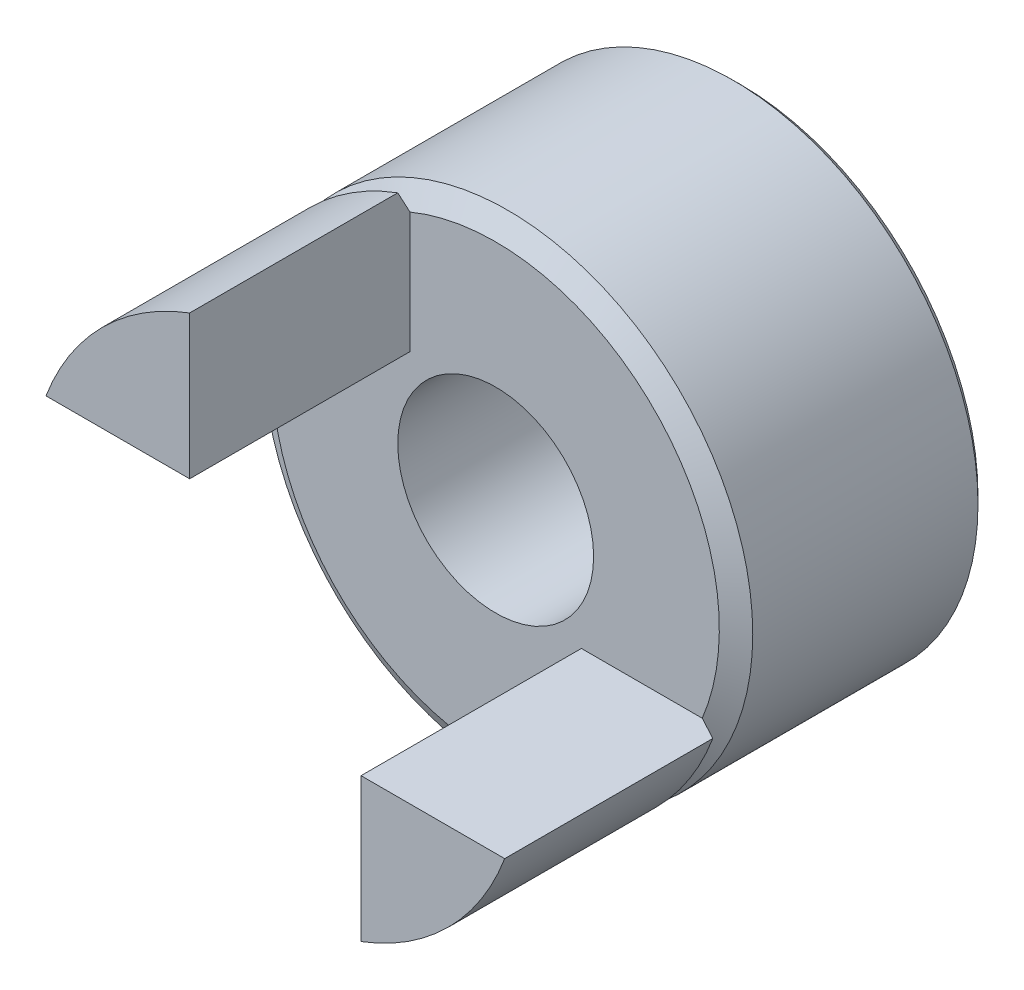
ISO-10303-21;
HEADER;
FILE_DESCRIPTION(('STEP AP214'),'2;1');
FILE_NAME('part.step','',(''),(''),'','','');
FILE_SCHEMA(('AUTOMOTIVE_DESIGN { 1 0 10303 214 1 1 1 1 }'));
ENDSEC;
DATA;
#1=APPLICATION_CONTEXT('core data for automotive mechanical design processes');
#2=APPLICATION_PROTOCOL_DEFINITION('international standard','automotive_design',2000,#1);
#3=PRODUCT_CONTEXT('',#1,'mechanical');
#4=PRODUCT('Part','Part','',(#3));
#5=PRODUCT_RELATED_PRODUCT_CATEGORY('part','',(#4));
#6=PRODUCT_DEFINITION_FORMATION('','',#4);
#7=PRODUCT_DEFINITION_CONTEXT('part definition',#1,'design');
#8=PRODUCT_DEFINITION('design','',#6,#7);
#9=PRODUCT_DEFINITION_SHAPE('','',#8);
#10=(LENGTH_UNIT() NAMED_UNIT(*) SI_UNIT(.MILLI.,.METRE.));
#11=(NAMED_UNIT(*) PLANE_ANGLE_UNIT() SI_UNIT($,.RADIAN.));
#12=(NAMED_UNIT(*) SI_UNIT($,.STERADIAN.) SOLID_ANGLE_UNIT());
#13=UNCERTAINTY_MEASURE_WITH_UNIT(LENGTH_MEASURE(1.E-05),#10,'distance_accuracy_value','');
#14=(GEOMETRIC_REPRESENTATION_CONTEXT(3) GLOBAL_UNCERTAINTY_ASSIGNED_CONTEXT((#13)) GLOBAL_UNIT_ASSIGNED_CONTEXT((#10,
#11,#12)) REPRESENTATION_CONTEXT('',''));
#15=CARTESIAN_POINT('',(0.,0.,0.));
#16=DIRECTION('',(0.,0.,1.));
#17=DIRECTION('',(1.,0.,0.));
#18=AXIS2_PLACEMENT_3D('',#15,#16,#17);
#19=CARTESIAN_POINT('',(0.,0.,10.));
#20=DIRECTION('',(0.,0.,1.));
#21=DIRECTION('',(1.,0.,0.));
#22=AXIS2_PLACEMENT_3D('',#19,#20,#21);
#23=PLANE('',#22);
#24=CARTESIAN_POINT('',(0.,0.,10.));
#25=DIRECTION('',(0.,0.,1.));
#26=DIRECTION('',(1.,0.,0.));
#27=AXIS2_PLACEMENT_3D('',#24,#25,#26);
#28=CIRCLE('',#27,4.);
#29=CARTESIAN_POINT('',(4.,0.,10.));
#30=VERTEX_POINT('',#29);
#31=EDGE_CURVE('E222',#30,#30,#28,.T.);
#32=ORIENTED_EDGE('',*,*,#31,.F.);
#33=EDGE_LOOP('',(#32));
#34=FACE_BOUND('',#33,.T.);
#35=DIRECTION('',(1.,0.,0.));
#36=VECTOR('',#35,1.);
#37=CARTESIAN_POINT('',(0.,3.5,10.));
#38=LINE('',#37,#36);
#39=CARTESIAN_POINT('',(-8.43679393634283,3.5,10.));
#40=VERTEX_POINT('',#39);
#41=CARTESIAN_POINT('',(-3.5,3.5,10.));
#42=VERTEX_POINT('',#41);
#43=EDGE_CURVE('E41',#40,#42,#38,.T.);
#44=ORIENTED_EDGE('',*,*,#43,.F.);
#45=CARTESIAN_POINT('',(0.,0.,10.));
#46=DIRECTION('',(0.,0.,-1.));
#47=DIRECTION('',(-1.,0.,0.));
#48=AXIS2_PLACEMENT_3D('',#45,#46,#47);
#49=CIRCLE('',#48,9.13397459621556);
#50=CARTESIAN_POINT('',(3.5,-8.43679393634283,10.));
#51=VERTEX_POINT('',#50);
#52=EDGE_CURVE('E128',#51,#40,#49,.T.);
#53=ORIENTED_EDGE('',*,*,#52,.F.);
#54=DIRECTION('',(0.,1.,0.));
#55=VECTOR('',#54,1.);
#56=CARTESIAN_POINT('',(3.5,0.,10.));
#57=LINE('',#56,#55);
#58=CARTESIAN_POINT('',(3.5,-3.5,10.));
#59=VERTEX_POINT('',#58);
#60=EDGE_CURVE('E62',#51,#59,#57,.T.);
#61=ORIENTED_EDGE('',*,*,#60,.T.);
#62=DIRECTION('',(1.,0.,0.));
#63=VECTOR('',#62,1.);
#64=CARTESIAN_POINT('',(0.,-3.5,10.));
#65=LINE('',#64,#63);
#66=CARTESIAN_POINT('',(8.43679393634283,-3.5,10.));
#67=VERTEX_POINT('',#66);
#68=EDGE_CURVE('E254',#59,#67,#65,.T.);
#69=ORIENTED_EDGE('',*,*,#68,.T.);
#70=CARTESIAN_POINT('',(-3.5,8.43679393634283,10.));
#71=VERTEX_POINT('',#70);
#72=EDGE_CURVE('E54',#71,#67,#49,.T.);
#73=ORIENTED_EDGE('',*,*,#72,.F.);
#74=DIRECTION('',(0.,1.,0.));
#75=VECTOR('',#74,1.);
#76=CARTESIAN_POINT('',(-3.5,0.,10.));
#77=LINE('',#76,#75);
#78=EDGE_CURVE('E228',#42,#71,#77,.T.);
#79=ORIENTED_EDGE('',*,*,#78,.F.);
#80=EDGE_LOOP('',(#44,#53,#61,#69,#73,#79));
#81=FACE_BOUND('',#80,.T.);
#82=ADVANCED_FACE('F37',(#34,#81),#23,.T.);
#83=CARTESIAN_POINT('',(0.,0.,10.));
#84=DIRECTION('',(0.,0.,-1.));
#85=DIRECTION('',(-1.,0.,0.));
#86=AXIS2_PLACEMENT_3D('',#83,#84,#85);
#87=CYLINDRICAL_SURFACE('',#86,10.);
#88=CARTESIAN_POINT('',(0.,0.,0.299999999999995));
#89=DIRECTION('',(0.,0.,1.));
#90=DIRECTION('',(1.,0.,0.));
#91=AXIS2_PLACEMENT_3D('',#88,#89,#90);
#92=CIRCLE('',#91,10.);
#93=CARTESIAN_POINT('',(10.,0.,0.299999999999995));
#94=VERTEX_POINT('',#93);
#95=EDGE_CURVE('E47',#94,#94,#92,.T.);
#96=ORIENTED_EDGE('',*,*,#95,.T.);
#97=EDGE_LOOP('',(#96));
#98=FACE_BOUND('',#97,.T.);
#99=CARTESIAN_POINT('',(0.,0.,9.5));
#100=DIRECTION('',(0.,0.,-1.));
#101=DIRECTION('',(-1.,0.,0.));
#102=AXIS2_PLACEMENT_3D('',#99,#100,#101);
#103=CIRCLE('',#102,10.);
#104=CARTESIAN_POINT('',(-10.,0.,9.5));
#105=VERTEX_POINT('',#104);
#106=EDGE_CURVE('E257',#105,#105,#103,.T.);
#107=ORIENTED_EDGE('',*,*,#106,.T.);
#108=EDGE_LOOP('',(#107));
#109=FACE_BOUND('',#108,.T.);
#110=ADVANCED_FACE('F197',(#98,#109),#87,.T.);
#111=CARTESIAN_POINT('',(0.,0.,10.5));
#112=DIRECTION('',(0.,0.,-1.));
#113=DIRECTION('',(-1.,0.,0.));
#114=AXIS2_PLACEMENT_3D('',#111,#112,#113);
#115=CIRCLE('',#114,10.);
#116=CARTESIAN_POINT('',(9.3674969975976,-3.5,10.5));
#117=VERTEX_POINT('',#116);
#118=CARTESIAN_POINT('',(3.5,-9.3674969975976,10.5));
#119=VERTEX_POINT('',#118);
#120=EDGE_CURVE('E129',#117,#119,#115,.T.);
#121=ORIENTED_EDGE('',*,*,#120,.F.);
#122=DIRECTION('',(0.,0.,-1.));
#123=VECTOR('',#122,1.);
#124=CARTESIAN_POINT('',(9.3674969975976,-3.5,19.));
#125=LINE('',#124,#123);
#126=CARTESIAN_POINT('',(9.3674969975976,-3.5,19.));
#127=VERTEX_POINT('',#126);
#128=EDGE_CURVE('E241',#127,#117,#125,.T.);
#129=ORIENTED_EDGE('',*,*,#128,.F.);
#130=CARTESIAN_POINT('',(0.,0.,19.));
#131=DIRECTION('',(0.,0.,1.));
#132=DIRECTION('',(1.,0.,0.));
#133=AXIS2_PLACEMENT_3D('',#130,#131,#132);
#134=CIRCLE('',#133,10.);
#135=CARTESIAN_POINT('',(3.5,-9.3674969975976,19.));
#136=VERTEX_POINT('',#135);
#137=EDGE_CURVE('E272',#136,#127,#134,.T.);
#138=ORIENTED_EDGE('',*,*,#137,.F.);
#139=DIRECTION('',(0.,0.,-1.));
#140=VECTOR('',#139,1.);
#141=CARTESIAN_POINT('',(3.5,-9.3674969975976,19.));
#142=LINE('',#141,#140);
#143=EDGE_CURVE('E239',#136,#119,#142,.T.);
#144=ORIENTED_EDGE('',*,*,#143,.T.);
#145=EDGE_LOOP('',(#121,#129,#138,#144));
#146=FACE_BOUND('',#145,.T.);
#147=ADVANCED_FACE('F203',(#146),#87,.T.);
#148=CARTESIAN_POINT('',(-9.3674969975976,3.5,10.5));
#149=VERTEX_POINT('',#148);
#150=CARTESIAN_POINT('',(-3.5,9.36749699759759,10.5));
#151=VERTEX_POINT('',#150);
#152=EDGE_CURVE('E111',#149,#151,#115,.T.);
#153=ORIENTED_EDGE('',*,*,#152,.F.);
#154=DIRECTION('',(0.,0.,-1.));
#155=VECTOR('',#154,1.);
#156=CARTESIAN_POINT('',(-9.3674969975976,3.5,19.));
#157=LINE('',#156,#155);
#158=CARTESIAN_POINT('',(-9.3674969975976,3.5,19.));
#159=VERTEX_POINT('',#158);
#160=EDGE_CURVE('E124',#159,#149,#157,.T.);
#161=ORIENTED_EDGE('',*,*,#160,.F.);
#162=CARTESIAN_POINT('',(0.,0.,19.));
#163=DIRECTION('',(0.,0.,1.));
#164=DIRECTION('',(1.,0.,0.));
#165=AXIS2_PLACEMENT_3D('',#162,#163,#164);
#166=CIRCLE('',#165,10.);
#167=CARTESIAN_POINT('',(-3.5,9.3674969975976,19.));
#168=VERTEX_POINT('',#167);
#169=EDGE_CURVE('E135',#168,#159,#166,.T.);
#170=ORIENTED_EDGE('',*,*,#169,.F.);
#171=DIRECTION('',(0.,0.,-1.));
#172=VECTOR('',#171,1.);
#173=CARTESIAN_POINT('',(-3.5,9.3674969975976,19.));
#174=LINE('',#173,#172);
#175=EDGE_CURVE('E127',#168,#151,#174,.T.);
#176=ORIENTED_EDGE('',*,*,#175,.T.);
#177=EDGE_LOOP('',(#153,#161,#170,#176));
#178=FACE_BOUND('',#177,.T.);
#179=ADVANCED_FACE('F122',(#178),#87,.T.);
#180=CARTESIAN_POINT('',(0.,3.5,19.));
#181=DIRECTION('',(0.,1.,0.));
#182=DIRECTION('',(0.,0.,1.));
#183=AXIS2_PLACEMENT_3D('',#180,#181,#182);
#184=PLANE('',#183);
#185=CARTESIAN_POINT('',(0.0335271971686652,3.5,6.74731596011501));
#186=CARTESIAN_POINT('',(-0.0668375018208296,3.5,6.74673409774683));
#187=CARTESIAN_POINT('',(-0.167208233798262,3.5,6.74869724875467));
#188=CARTESIAN_POINT('',(-0.367696321437432,3.5,6.75753158287431));
#189=CARTESIAN_POINT('',(-0.467813759446565,3.5,6.76440088515545));
#190=CARTESIAN_POINT('',(-0.667197524888338,3.5,6.78282750847821));
#191=CARTESIAN_POINT('',(-0.766465658892408,3.5,6.79436549439625));
#192=CARTESIAN_POINT('',(-0.964402099813783,3.5,6.82179711419414));
#193=CARTESIAN_POINT('',(-1.06307035393674,3.5,6.8376911259264));
#194=CARTESIAN_POINT('',(-1.25857949539543,3.5,6.87323949416887));
#195=CARTESIAN_POINT('',(-1.35542846991008,3.5,6.89284971548486));
#196=CARTESIAN_POINT('',(-1.54835563398058,3.5,6.93552915515548));
#197=CARTESIAN_POINT('',(-1.64443382889266,3.5,6.95859834945135));
#198=CARTESIAN_POINT('',(-1.835899700324,3.5,7.00781040167532));
#199=CARTESIAN_POINT('',(-1.9312865778452,3.5,7.0339563526648));
#200=CARTESIAN_POINT('',(-2.12127842419917,3.5,7.08891631667661));
#201=CARTESIAN_POINT('',(-2.21588343372643,3.5,7.11773018987476));
#202=CARTESIAN_POINT('',(-2.50824400482241,3.5,7.21070608349793));
#203=CARTESIAN_POINT('',(-2.70474518571076,3.5,7.27882003354779));
#204=CARTESIAN_POINT('',(-3.094993726335,3.5,7.42257025677505));
#205=CARTESIAN_POINT('',(-3.28874025486641,3.5,7.49820874761193));
#206=CARTESIAN_POINT('',(-3.67414886671948,3.5,7.65513161614566));
#207=CARTESIAN_POINT('',(-3.8658086411767,3.5,7.73642163219215));
#208=CARTESIAN_POINT('',(-4.24726971477068,3.5,7.90317249169705));
#209=CARTESIAN_POINT('',(-4.43707120931096,3.5,7.98863289084733));
#210=CARTESIAN_POINT('',(-4.8157182055926,3.5,8.16297132922256));
#211=CARTESIAN_POINT('',(-5.00455970828207,3.5,8.25185802402439));
#212=CARTESIAN_POINT('',(-5.38105632661693,3.5,8.43211210097172));
#213=CARTESIAN_POINT('',(-5.56871141719806,3.5,8.5234795353111));
#214=CARTESIAN_POINT('',(-6.13003313013939,3.5,8.80036664210018));
#215=CARTESIAN_POINT('',(-6.50227411774885,3.5,8.98877309153701));
#216=CARTESIAN_POINT('',(-7.2497495182192,3.5,9.37335832316995));
#217=CARTESIAN_POINT('',(-7.62494555466536,3.5,9.56961117435592));
#218=CARTESIAN_POINT('',(-8.37356373583642,3.5,9.96558392130251));
#219=CARTESIAN_POINT('',(-8.74698564104083,3.5,10.1653042691585));
#220=CARTESIAN_POINT('',(-9.49199244541637,3.5,10.5668794644709));
#221=CARTESIAN_POINT('',(-9.86357920111912,3.5,10.7687308749107));
#222=CARTESIAN_POINT('',(-10.6057909450581,3.5,11.1741945414932));
#223=CARTESIAN_POINT('',(-10.976415931395,3.5,11.3778068011098));
#224=CARTESIAN_POINT('',(-11.476726900897,3.5,11.6538297981879));
#225=CARTESIAN_POINT('',(-11.6067330969078,3.5,11.7256610111123));
#226=CARTESIAN_POINT('',(-11.8666850799375,3.5,11.8694852672155));
#227=CARTESIAN_POINT('',(-11.9966308527804,3.5,11.941478336025));
#228=CARTESIAN_POINT('',(-12.255705560692,3.5,12.0851891353176));
#229=CARTESIAN_POINT('',(-12.3848349249686,3.5,12.156906092213));
#230=CARTESIAN_POINT('',(-12.6430029880758,3.5,12.30045089632));
#231=CARTESIAN_POINT('',(-12.7720416986648,3.5,12.3722787223829));
#232=CARTESIAN_POINT('',(-12.9010491947663,3.5,12.4441625493059));
#233=B_SPLINE_CURVE_WITH_KNOTS('',3,(#185,#186,#187,#188,#189,#190,#191,#192,#193,#194,#195,
#196,#197,#198,#199,#200,#201,#202,#203,#204,#205,#206,#207,#208,#209,#210,#211,#212,#213,#214,
#215,#216,#217,#218,#219,#220,#221,#222,#223,#224,#225,#226,#227,#228,#229,#230,#231,#232),
.UNSPECIFIED.,.F.,.F.,(4,2,2,2,2,2,2,2,2,2,2,2,2,2,2,2,2,2,2,2,2,2,2,4),(0.,0.30105454503711,
0.601993739188417,0.901699160429758,1.20143058708981,1.49780315864791,1.79417366889369,
2.09084470726875,2.387500206086,3.01117586329075,3.63503588006326,4.25952749041464,
4.88395271274112,5.51007465170351,6.13620977427031,7.3877583767549,8.65800706425606,
9.92842263054628,11.1970326499085,12.4656451725296,12.9112368870873,13.3569049868657,
13.8000295444863,14.2430780355783),.UNSPECIFIED.);
#234=EDGE_CURVE('E108',#40,#149,#233,.T.);
#235=ORIENTED_EDGE('',*,*,#234,.F.);
#236=ORIENTED_EDGE('',*,*,#43,.T.);
#237=DIRECTION('',(0.,0.,-1.));
#238=VECTOR('',#237,1.);
#239=CARTESIAN_POINT('',(-3.5,3.5,19.));
#240=LINE('',#239,#238);
#241=CARTESIAN_POINT('',(-3.5,3.5,19.));
#242=VERTEX_POINT('',#241);
#243=EDGE_CURVE('E137',#242,#42,#240,.T.);
#244=ORIENTED_EDGE('',*,*,#243,.F.);
#245=DIRECTION('',(1.,0.,0.));
#246=VECTOR('',#245,1.);
#247=CARTESIAN_POINT('',(0.,3.5,19.));
#248=LINE('',#247,#246);
#249=EDGE_CURVE('E134',#159,#242,#248,.T.);
#250=ORIENTED_EDGE('',*,*,#249,.F.);
#251=ORIENTED_EDGE('',*,*,#160,.T.);
#252=EDGE_LOOP('',(#235,#236,#244,#250,#251));
#253=FACE_BOUND('',#252,.T.);
#254=ADVANCED_FACE('F131',(#253),#184,.F.);
#255=CARTESIAN_POINT('',(-3.5,0.,19.));
#256=DIRECTION('',(-1.,0.,0.));
#257=DIRECTION('',(0.,0.,1.));
#258=AXIS2_PLACEMENT_3D('',#255,#256,#257);
#259=PLANE('',#258);
#260=CARTESIAN_POINT('',(-3.5,12.9010491947663,12.4441625493059));
#261=CARTESIAN_POINT('',(-3.5,12.5680867000781,12.2586491772017));
#262=CARTESIAN_POINT('',(-3.5,12.2349273148496,12.0734875620625));
#263=CARTESIAN_POINT('',(-3.5,11.5680728857833,11.7041108129314));
#264=CARTESIAN_POINT('',(-3.5,11.2343778279841,11.519895704152));
#265=CARTESIAN_POINT('',(-3.5,10.5658713126068,11.1524138546853));
#266=CARTESIAN_POINT('',(-3.5,10.2310589525529,10.9691487541575));
#267=CARTESIAN_POINT('',(-3.5,9.56058025182923,10.6042004002696));
#268=CARTESIAN_POINT('',(-3.5,9.22491392632185,10.4225171190738));
#269=CARTESIAN_POINT('',(-3.5,8.52861300129965,10.048457248276));
#270=CARTESIAN_POINT('',(-3.5,8.16789503574098,9.85623549325133));
#271=CARTESIAN_POINT('',(-3.5,7.44463232841988,9.47520385031002));
#272=CARTESIAN_POINT('',(-3.5,7.08208748288518,9.28639415906755));
#273=CARTESIAN_POINT('',(-3.5,6.35468234190206,8.91391973592338));
#274=CARTESIAN_POINT('',(-3.5,5.98982394673394,8.73025132008726));
#275=CARTESIAN_POINT('',(-3.5,5.43967975028417,8.46061302340093));
#276=CARTESIAN_POINT('',(-3.5,5.25583059956079,8.37171485272413));
#277=CARTESIAN_POINT('',(-3.5,4.88694339879431,8.1964247464143));
#278=CARTESIAN_POINT('',(-3.5,4.70190538358925,8.11003273774707));
#279=CARTESIAN_POINT('',(-3.5,4.37440401781308,7.96058107360478));
#280=CARTESIAN_POINT('',(-3.5,4.23224918744295,7.89684627819677));
#281=CARTESIAN_POINT('',(-3.5,3.94692004976902,7.77168825584133));
#282=CARTESIAN_POINT('',(-3.5,3.80374572879724,7.7102650599544));
#283=CARTESIAN_POINT('',(-3.5,3.51607350651577,7.59022912512891));
#284=CARTESIAN_POINT('',(-3.5,3.37157456549036,7.53161886846925));
#285=CARTESIAN_POINT('',(-3.5,3.08117120511449,7.41797857675549));
#286=CARTESIAN_POINT('',(-3.5,2.93526681152193,7.36294847623026));
#287=CARTESIAN_POINT('',(-3.5,2.64437768373464,7.25829628707925));
#288=CARTESIAN_POINT('',(-3.5,2.49942092956177,7.20859692156962));
#289=CARTESIAN_POINT('',(-3.5,2.20772689165874,7.11462152970015));
#290=CARTESIAN_POINT('',(-3.5,2.06098942533396,7.0703460647619));
#291=CARTESIAN_POINT('',(-3.5,1.76586542073207,6.98861634439367));
#292=CARTESIAN_POINT('',(-3.5,1.61748195267952,6.951151111979));
#293=CARTESIAN_POINT('',(-3.5,1.31889401620262,6.88447223600032));
#294=CARTESIAN_POINT('',(-3.5,1.168690294319,6.8552553215401));
#295=CARTESIAN_POINT('',(-3.5,0.931187469512068,6.81696776834379));
#296=CARTESIAN_POINT('',(-3.5,0.844410707488042,6.80462147544605));
#297=CARTESIAN_POINT('',(-3.5,0.670428171540512,6.78337563286994));
#298=CARTESIAN_POINT('',(-3.5,0.583222382812669,6.77447620298865));
#299=CARTESIAN_POINT('',(-3.5,0.407839957627205,6.76027474878846));
#300=CARTESIAN_POINT('',(-3.5,0.319661017984115,6.75500097129317));
#301=CARTESIAN_POINT('',(-3.5,0.143143537197677,6.74826886348073));
#302=CARTESIAN_POINT('',(-3.5,0.0548049717759209,6.74681117296035));
#303=CARTESIAN_POINT('',(-3.5,-0.0335271971686652,6.74731596011501));
#304=B_SPLINE_CURVE_WITH_KNOTS('',3,(#260,#261,#262,#263,#264,#265,#266,#267,#268,#269,#270,
#271,#272,#273,#274,#275,#276,#277,#278,#279,#280,#281,#282,#283,#284,#285,#286,#287,#288,#289,
#290,#291,#292,#293,#294,#295,#296,#297,#298,#299,#300,#301,#302,#303),.UNSPECIFIED.,.F.,.F.,(4,
2,2,2,2,2,2,2,2,2,2,2,2,2,2,2,2,2,2,2,2,4),(0.,1.1434663553326,2.28696301340616,3.4320224372984,
4.57706167041126,5.8032615978421,7.02953198043759,8.25489994851591,8.86752872414971,
9.48013962867457,9.94748963524885,10.4148459192717,10.8826073117231,11.3503601477092,
11.8099957102485,12.2696788089975,12.7286142732355,13.1873674887247,13.4502603227313,
13.7131622928617,13.9780899565386,14.2430620345634),.UNSPECIFIED.);
#305=EDGE_CURVE('E117',#151,#71,#304,.T.);
#306=ORIENTED_EDGE('',*,*,#305,.F.);
#307=ORIENTED_EDGE('',*,*,#175,.F.);
#308=DIRECTION('',(0.,1.,0.));
#309=VECTOR('',#308,1.);
#310=CARTESIAN_POINT('',(-3.5,0.,19.));
#311=LINE('',#310,#309);
#312=EDGE_CURVE('E139',#242,#168,#311,.T.);
#313=ORIENTED_EDGE('',*,*,#312,.F.);
#314=ORIENTED_EDGE('',*,*,#243,.T.);
#315=ORIENTED_EDGE('',*,*,#78,.T.);
#316=EDGE_LOOP('',(#306,#307,#313,#314,#315));
#317=FACE_BOUND('',#316,.T.);
#318=ADVANCED_FACE('F179',(#317),#259,.F.);
#319=CARTESIAN_POINT('',(3.5,0.,19.));
#320=DIRECTION('',(-1.,0.,0.));
#321=DIRECTION('',(0.,0.,1.));
#322=AXIS2_PLACEMENT_3D('',#319,#320,#321);
#323=PLANE('',#322);
#324=ORIENTED_EDGE('',*,*,#60,.F.);
#325=CARTESIAN_POINT('',(3.5,0.0334573591593998,6.74731557429212));
#326=CARTESIAN_POINT('',(3.5,-0.0669089186267847,6.74673485853601));
#327=CARTESIAN_POINT('',(3.5,-0.167281198250569,6.74869923783571));
#328=CARTESIAN_POINT('',(3.5,-0.367772311296723,6.7575361471907));
#329=CARTESIAN_POINT('',(3.5,-0.467891227101125,6.76440679614477));
#330=CARTESIAN_POINT('',(3.5,-0.667277862653203,6.78283618084975));
#331=CARTESIAN_POINT('',(3.5,-0.766547389301716,6.79437558057998));
#332=CARTESIAN_POINT('',(3.5,-0.964486557555642,6.82181006036837));
#333=CARTESIAN_POINT('',(3.5,-1.06315614635288,6.83770551834372));
#334=CARTESIAN_POINT('',(3.5,-1.2586679552332,6.87325677331333));
#335=CARTESIAN_POINT('',(3.5,-1.35551826258979,6.89286843757559));
#336=CARTESIAN_POINT('',(3.5,-1.54844805504017,6.93555074369747));
#337=CARTESIAN_POINT('',(3.5,-1.644527545494,6.95862136148253));
#338=CARTESIAN_POINT('',(3.5,-1.83599599038074,7.00783622931742));
#339=CARTESIAN_POINT('',(3.5,-1.9313841457357,7.03398357260279));
#340=CARTESIAN_POINT('',(3.5,-2.12137853150632,7.08894627926111));
#341=CARTESIAN_POINT('',(3.5,-2.21598480261838,7.11776150280832));
#342=CARTESIAN_POINT('',(3.5,-2.5083584757156,7.21074443913791));
#343=CARTESIAN_POINT('',(3.5,-2.70487133284827,7.27886447592276));
#344=CARTESIAN_POINT('',(3.5,-3.09514300323454,7.42262726825995));
#345=CARTESIAN_POINT('',(3.5,-3.28890098518045,7.49827224168294));
#346=CARTESIAN_POINT('',(3.5,-3.67433237956518,7.65520828648127));
#347=CARTESIAN_POINT('',(3.5,-3.86600348295454,7.73650499651854));
#348=CARTESIAN_POINT('',(3.5,-4.24748712928423,7.90326933966407));
#349=CARTESIAN_POINT('',(3.5,-4.43729986764995,7.98873652842409));
#350=CARTESIAN_POINT('',(3.5,-4.81596932046877,8.16308859731059));
#351=CARTESIAN_POINT('',(3.5,-5.00482203586589,8.25198213286028));
#352=CARTESIAN_POINT('',(3.5,-5.38134105616782,8.43224990110808));
#353=CARTESIAN_POINT('',(3.5,-5.56900733600576,8.52362418600469));
#354=CARTESIAN_POINT('',(3.5,-6.13036258356939,8.80053182287959));
#355=CARTESIAN_POINT('',(3.5,-6.50262590152716,8.98895194060899));
#356=CARTESIAN_POINT('',(3.5,-7.25014570191986,9.37356432711928));
#357=CARTESIAN_POINT('',(3.5,-7.62536381232196,9.5698306556295));
#358=CARTESIAN_POINT('',(3.5,-8.37402617582539,9.96583027457252));
#359=CARTESIAN_POINT('',(3.5,-8.7474701894002,10.1655640171082));
#360=CARTESIAN_POINT('',(3.5,-9.49252124709421,10.5671659299901));
#361=CARTESIAN_POINT('',(3.5,-9.86413014757001,10.7690306636676));
#362=CARTESIAN_POINT('',(3.5,-10.6063862078538,11.1745209171372));
#363=CARTESIAN_POINT('',(3.5,-10.9770333657632,11.3781464404016));
#364=CARTESIAN_POINT('',(3.5,-11.4773047781432,11.654148964845));
#365=CARTESIAN_POINT('',(3.5,-11.6072492831916,11.7259463761291));
#366=CARTESIAN_POINT('',(3.5,-11.8670779503029,11.8697028596252));
#367=CARTESIAN_POINT('',(3.5,-11.9969620982113,11.9416619574291));
#368=CARTESIAN_POINT('',(3.5,-12.255914390591,12.0853050975068));
#369=CARTESIAN_POINT('',(3.5,-12.3849829636031,12.1569883673966));
#370=CARTESIAN_POINT('',(3.5,-12.6430295308325,12.3004656905922));
#371=CARTESIAN_POINT('',(3.5,-12.7720075367914,12.3722597227795));
#372=CARTESIAN_POINT('',(3.5,-12.900954356757,12.4441097047613));
#373=B_SPLINE_CURVE_WITH_KNOTS('',3,(#325,#326,#327,#328,#329,#330,#331,#332,#333,#334,#335,
#336,#337,#338,#339,#340,#341,#342,#343,#344,#345,#346,#347,#348,#349,#350,#351,#352,#353,#354,
#355,#356,#357,#358,#359,#360,#361,#362,#363,#364,#365,#366,#367,#368,#369,#370,#371,#372),
.UNSPECIFIED.,.F.,.F.,(4,2,2,2,2,2,2,2,2,2,2,2,2,2,2,2,2,2,2,2,2,2,2,4),(0.,0.301059256489437,
0.60200314649575,0.901713206565488,1.20144927672442,1.49782662754899,1.7942019156613,
2.09087775705897,2.38753805823258,3.01125277418414,3.63515186914811,4.25968260920664,
4.88414695262968,5.51030806762499,6.13648236816566,7.38810926416637,8.65843537322074,
9.92892837814733,11.1976158544953,12.4663058333936,12.9116865163723,13.3571435126515,
13.8000595673964,14.2428996270669),.UNSPECIFIED.);
#374=EDGE_CURVE('E164',#51,#119,#373,.T.);
#375=ORIENTED_EDGE('',*,*,#374,.T.);
#376=ORIENTED_EDGE('',*,*,#143,.F.);
#377=DIRECTION('',(0.,1.,0.));
#378=VECTOR('',#377,1.);
#379=CARTESIAN_POINT('',(3.5,0.,19.));
#380=LINE('',#379,#378);
#381=CARTESIAN_POINT('',(3.5,-3.5,19.));
#382=VERTEX_POINT('',#381);
#383=EDGE_CURVE('E266',#136,#382,#380,.T.);
#384=ORIENTED_EDGE('',*,*,#383,.T.);
#385=DIRECTION('',(0.,0.,-1.));
#386=VECTOR('',#385,1.);
#387=CARTESIAN_POINT('',(3.5,-3.5,19.));
#388=LINE('',#387,#386);
#389=EDGE_CURVE('E247',#382,#59,#388,.T.);
#390=ORIENTED_EDGE('',*,*,#389,.T.);
#391=EDGE_LOOP('',(#324,#375,#376,#384,#390));
#392=FACE_BOUND('',#391,.T.);
#393=ADVANCED_FACE('F183',(#392),#323,.T.);
#394=CARTESIAN_POINT('',(0.,-3.5,19.));
#395=DIRECTION('',(0.,1.,0.));
#396=DIRECTION('',(0.,0.,1.));
#397=AXIS2_PLACEMENT_3D('',#394,#395,#396);
#398=PLANE('',#397);
#399=ORIENTED_EDGE('',*,*,#128,.T.);
#400=CARTESIAN_POINT('',(12.900954356757,-3.5,12.4441097047613));
#401=CARTESIAN_POINT('',(12.5679895860019,-3.5,12.2585951589753));
#402=CARTESIAN_POINT('',(12.2348279183983,-3.5,12.0734323815259));
#403=CARTESIAN_POINT('',(11.5679689035894,-3.5,11.7040533429922));
#404=CARTESIAN_POINT('',(11.2342715424201,-3.5,11.5198371071254));
#405=CARTESIAN_POINT('',(10.5657603346317,-3.5,11.1523530204834));
#406=CARTESIAN_POINT('',(10.2309455853898,-3.5,10.9690868101364));
#407=CARTESIAN_POINT('',(9.56046206903006,-3.5,10.6041363097396));
#408=CARTESIAN_POINT('',(9.22479331707806,-3.5,10.4224519918477));
#409=CARTESIAN_POINT('',(8.52848591860914,-3.5,10.0483893381673));
#410=CARTESIAN_POINT('',(8.16776389691648,-3.5,9.85616585417569));
#411=CARTESIAN_POINT('',(7.44449295775521,-3.5,9.47513097941253));
#412=CARTESIAN_POINT('',(7.08194393648786,-3.5,9.28631978536582));
#413=CARTESIAN_POINT('',(6.35453028842514,-3.5,8.91384275285036));
#414=CARTESIAN_POINT('',(5.98966756224297,-3.5,8.73017322978722));
#415=CARTESIAN_POINT('',(5.43951664027799,-3.5,8.46053379330484));
#416=CARTESIAN_POINT('',(5.25566521126307,-3.5,8.37163533028277));
#417=CARTESIAN_POINT('',(4.88677335249785,-3.5,8.19634488024932));
#418=CARTESIAN_POINT('',(4.7017329575955,-3.5,8.10995282018225));
#419=CARTESIAN_POINT('',(4.37423110979534,-3.5,7.96050310818939));
#420=CARTESIAN_POINT('',(4.23207822784239,-3.5,7.89677019549535));
#421=CARTESIAN_POINT('',(3.94675295326399,-3.5,7.77161605461905));
#422=CARTESIAN_POINT('',(3.80358054696873,-3.5,7.71019485750199));
#423=CARTESIAN_POINT('',(3.51591211776992,-3.5,7.5901630635212));
#424=CARTESIAN_POINT('',(3.37141505509313,-3.5,7.53155494912586));
#425=CARTESIAN_POINT('',(3.08101541923338,-3.5,7.41791911687007));
#426=CARTESIAN_POINT('',(2.93511287180923,-3.5,7.36289133353445));
#427=CARTESIAN_POINT('',(2.64422736061042,-3.5,7.25824393751467));
#428=CARTESIAN_POINT('',(2.49927237699643,-3.5,7.20854704501702));
#429=CARTESIAN_POINT('',(2.20758187989919,-3.5,7.11457683010691));
#430=CARTESIAN_POINT('',(2.06084618381995,-3.5,7.07030406914403));
#431=CARTESIAN_POINT('',(1.7657257724673,-3.5,6.98857999619389));
#432=CARTESIAN_POINT('',(1.61734412755259,-3.5,6.95111770611995));
#433=CARTESIAN_POINT('',(1.31875993756777,-3.5,6.88444491877215));
#434=CARTESIAN_POINT('',(1.16855813904831,-3.5,6.85523115030853));
#435=CARTESIAN_POINT('',(0.931073528477519,-3.5,6.81695104587167));
#436=CARTESIAN_POINT('',(0.844313084899505,-3.5,6.80460846680027));
#437=CARTESIAN_POINT('',(0.67036338097387,-3.5,6.78336880943073));
#438=CARTESIAN_POINT('',(0.583174105815909,-3.5,6.77447185099055));
#439=CARTESIAN_POINT('',(0.407825100036503,-3.5,6.76027399119621));
#440=CARTESIAN_POINT('',(0.319663067704387,-3.5,6.75500132045161));
#441=CARTESIAN_POINT('',(0.143179462451876,-3.5,6.74826996078571));
#442=CARTESIAN_POINT('',(0.054857865284129,-3.5,6.74681191078971));
#443=CARTESIAN_POINT('',(-0.0334573591594003,-3.5,6.74731557429212));
#444=B_SPLINE_CURVE_WITH_KNOTS('',3,(#400,#401,#402,#403,#404,#405,#406,#407,#408,#409,#410,
#411,#412,#413,#414,#415,#416,#417,#418,#419,#420,#421,#422,#423,#424,#425,#426,#427,#428,#429,
#430,#431,#432,#433,#434,#435,#436,#437,#438,#439,#440,#441,#442,#443),.UNSPECIFIED.,.F.,.F.,(4,
2,2,2,2,2,2,2,2,2,2,2,2,2,2,2,2,2,2,2,2,4),(0.,1.14347403400793,2.28697837562583,
3.43204568517428,4.57709280005803,5.80330590399239,7.0295894773142,8.25497053339859,
8.8676058418355,9.48022327543426,9.94756563584489,10.4149142742373,10.8826680251287,
11.3504132195858,11.810041343153,12.2697170025117,12.7286449909004,13.18739072167,
13.4502335520614,13.7130855247752,13.9779624060684,14.2428836497545),.UNSPECIFIED.);
#445=EDGE_CURVE('E11',#117,#67,#444,.T.);
#446=ORIENTED_EDGE('',*,*,#445,.T.);
#447=ORIENTED_EDGE('',*,*,#68,.F.);
#448=ORIENTED_EDGE('',*,*,#389,.F.);
#449=DIRECTION('',(1.,0.,0.));
#450=VECTOR('',#449,1.);
#451=CARTESIAN_POINT('',(0.,-3.5,19.));
#452=LINE('',#451,#450);
#453=EDGE_CURVE('E269',#382,#127,#452,.T.);
#454=ORIENTED_EDGE('',*,*,#453,.T.);
#455=EDGE_LOOP('',(#399,#446,#447,#448,#454));
#456=FACE_BOUND('',#455,.T.);
#457=ADVANCED_FACE('F150',(#456),#398,.T.);
#458=CARTESIAN_POINT('',(0.,0.,0.));
#459=DIRECTION('',(0.,0.,1.));
#460=DIRECTION('',(1.,0.,0.));
#461=AXIS2_PLACEMENT_3D('',#458,#459,#460);
#462=PLANE('',#461);
#463=CARTESIAN_POINT('',(0.,0.,0.));
#464=DIRECTION('',(0.,0.,1.));
#465=DIRECTION('',(1.,0.,0.));
#466=AXIS2_PLACEMENT_3D('',#463,#464,#465);
#467=CIRCLE('',#466,4.3);
#468=CARTESIAN_POINT('',(4.3,0.,0.));
#469=VERTEX_POINT('',#468);
#470=EDGE_CURVE('E217',#469,#469,#467,.T.);
#471=ORIENTED_EDGE('',*,*,#470,.T.);
#472=EDGE_LOOP('',(#471));
#473=FACE_BOUND('',#472,.T.);
#474=CARTESIAN_POINT('',(0.,0.,0.));
#475=DIRECTION('',(0.,0.,1.));
#476=DIRECTION('',(1.,0.,0.));
#477=AXIS2_PLACEMENT_3D('',#474,#475,#476);
#478=CIRCLE('',#477,9.7);
#479=CARTESIAN_POINT('',(9.7,0.,0.));
#480=VERTEX_POINT('',#479);
#481=EDGE_CURVE('E218',#480,#480,#478,.F.);
#482=ORIENTED_EDGE('',*,*,#481,.T.);
#483=EDGE_LOOP('',(#482));
#484=FACE_BOUND('',#483,.T.);
#485=ADVANCED_FACE('F193',(#473,#484),#462,.F.);
#486=CARTESIAN_POINT('',(0.,0.,10.));
#487=DIRECTION('',(0.,0.,-1.));
#488=DIRECTION('',(-1.,0.,0.));
#489=AXIS2_PLACEMENT_3D('',#486,#487,#488);
#490=CYLINDRICAL_SURFACE('',#489,4.);
#491=CARTESIAN_POINT('',(0.,0.,0.3));
#492=DIRECTION('',(0.,0.,1.));
#493=DIRECTION('',(1.,0.,0.));
#494=AXIS2_PLACEMENT_3D('',#491,#492,#493);
#495=CIRCLE('',#494,4.);
#496=CARTESIAN_POINT('',(4.,0.,0.3));
#497=VERTEX_POINT('',#496);
#498=EDGE_CURVE('E214',#497,#497,#495,.F.);
#499=ORIENTED_EDGE('',*,*,#498,.T.);
#500=EDGE_LOOP('',(#499));
#501=FACE_BOUND('',#500,.T.);
#502=ORIENTED_EDGE('',*,*,#31,.T.);
#503=EDGE_LOOP('',(#502));
#504=FACE_BOUND('',#503,.T.);
#505=ADVANCED_FACE('F189',(#501,#504),#490,.F.);
#506=CARTESIAN_POINT('',(0.,0.,0.));
#507=DIRECTION('',(0.,0.,-1.));
#508=DIRECTION('',(-1.,0.,0.));
#509=AXIS2_PLACEMENT_3D('',#506,#507,#508);
#510=CONICAL_SURFACE('',#509,4.3,0.785398163397445);
#511=ORIENTED_EDGE('',*,*,#498,.F.);
#512=EDGE_LOOP('',(#511));
#513=FACE_BOUND('',#512,.T.);
#514=ORIENTED_EDGE('',*,*,#470,.F.);
#515=EDGE_LOOP('',(#514));
#516=FACE_BOUND('',#515,.T.);
#517=ADVANCED_FACE('F192',(#513,#516),#510,.F.);
#518=CARTESIAN_POINT('',(0.,0.,0.299999999999995));
#519=DIRECTION('',(0.,0.,1.));
#520=DIRECTION('',(1.,0.,0.));
#521=AXIS2_PLACEMENT_3D('',#518,#519,#520);
#522=CONICAL_SURFACE('',#521,10.,0.785398163397451);
#523=ORIENTED_EDGE('',*,*,#481,.F.);
#524=EDGE_LOOP('',(#523));
#525=FACE_BOUND('',#524,.T.);
#526=ORIENTED_EDGE('',*,*,#95,.F.);
#527=EDGE_LOOP('',(#526));
#528=FACE_BOUND('',#527,.T.);
#529=ADVANCED_FACE('F39',(#525,#528),#522,.T.);
#530=CARTESIAN_POINT('',(0.,0.,19.));
#531=DIRECTION('',(0.,0.,1.));
#532=DIRECTION('',(1.,0.,0.));
#533=AXIS2_PLACEMENT_3D('',#530,#531,#532);
#534=PLANE('',#533);
#535=ORIENTED_EDGE('',*,*,#249,.T.);
#536=ORIENTED_EDGE('',*,*,#312,.T.);
#537=ORIENTED_EDGE('',*,*,#169,.T.);
#538=EDGE_LOOP('',(#535,#536,#537));
#539=FACE_BOUND('',#538,.T.);
#540=ADVANCED_FACE('F185',(#539),#534,.T.);
#541=CARTESIAN_POINT('',(0.,0.,19.));
#542=DIRECTION('',(0.,0.,1.));
#543=DIRECTION('',(1.,0.,0.));
#544=AXIS2_PLACEMENT_3D('',#541,#542,#543);
#545=PLANE('',#544);
#546=ORIENTED_EDGE('',*,*,#383,.F.);
#547=ORIENTED_EDGE('',*,*,#137,.T.);
#548=ORIENTED_EDGE('',*,*,#453,.F.);
#549=EDGE_LOOP('',(#546,#547,#548));
#550=FACE_BOUND('',#549,.T.);
#551=ADVANCED_FACE('F277',(#550),#545,.T.);
#552=CARTESIAN_POINT('',(0.,0.,10.));
#553=DIRECTION('',(0.,0.,1.));
#554=DIRECTION('',(1.,0.,0.));
#555=AXIS2_PLACEMENT_3D('',#552,#553,#554);
#556=CONICAL_SURFACE('',#555,9.13397459621556,1.0471975511966);
#557=ORIENTED_EDGE('',*,*,#234,.T.);
#558=ORIENTED_EDGE('',*,*,#152,.T.);
#559=ORIENTED_EDGE('',*,*,#305,.T.);
#560=EDGE_CURVE('E113',#40,#71,#49,.T.);
#561=ORIENTED_EDGE('',*,*,#560,.F.);
#562=EDGE_LOOP('',(#557,#558,#559,#561));
#563=FACE_BOUND('',#562,.T.);
#564=ADVANCED_FACE('F110',(#563),#556,.T.);
#565=CARTESIAN_POINT('',(0.,0.,9.5));
#566=DIRECTION('',(0.,0.,-1.));
#567=DIRECTION('',(-1.,0.,0.));
#568=AXIS2_PLACEMENT_3D('',#565,#566,#567);
#569=CONICAL_SURFACE('',#568,10.,1.0471975511966);
#570=ORIENTED_EDGE('',*,*,#560,.T.);
#571=ORIENTED_EDGE('',*,*,#72,.T.);
#572=EDGE_CURVE('E255',#67,#51,#49,.T.);
#573=ORIENTED_EDGE('',*,*,#572,.T.);
#574=ORIENTED_EDGE('',*,*,#52,.T.);
#575=EDGE_LOOP('',(#570,#571,#573,#574));
#576=FACE_BOUND('',#575,.T.);
#577=ORIENTED_EDGE('',*,*,#106,.F.);
#578=EDGE_LOOP('',(#577));
#579=FACE_BOUND('',#578,.T.);
#580=ADVANCED_FACE('F158',(#576,#579),#569,.T.);
#581=ORIENTED_EDGE('',*,*,#572,.F.);
#582=ORIENTED_EDGE('',*,*,#445,.F.);
#583=ORIENTED_EDGE('',*,*,#120,.T.);
#584=ORIENTED_EDGE('',*,*,#374,.F.);
#585=EDGE_LOOP('',(#581,#582,#583,#584));
#586=FACE_BOUND('',#585,.T.);
#587=ADVANCED_FACE('F154',(#586),#556,.T.);
#588=CLOSED_SHELL('',(#82,#110,#147,#179,#254,#318,#393,#457,#485,#505,#517,#529,#540,#551,#564,
#580,#587));
#589=MANIFOLD_SOLID_BREP('B2',#588);
#590=ADVANCED_BREP_SHAPE_REPRESENTATION('',(#18,#589),#14);
#591=SHAPE_DEFINITION_REPRESENTATION(#9,#590);
ENDSEC;
END-ISO-10303-21;
